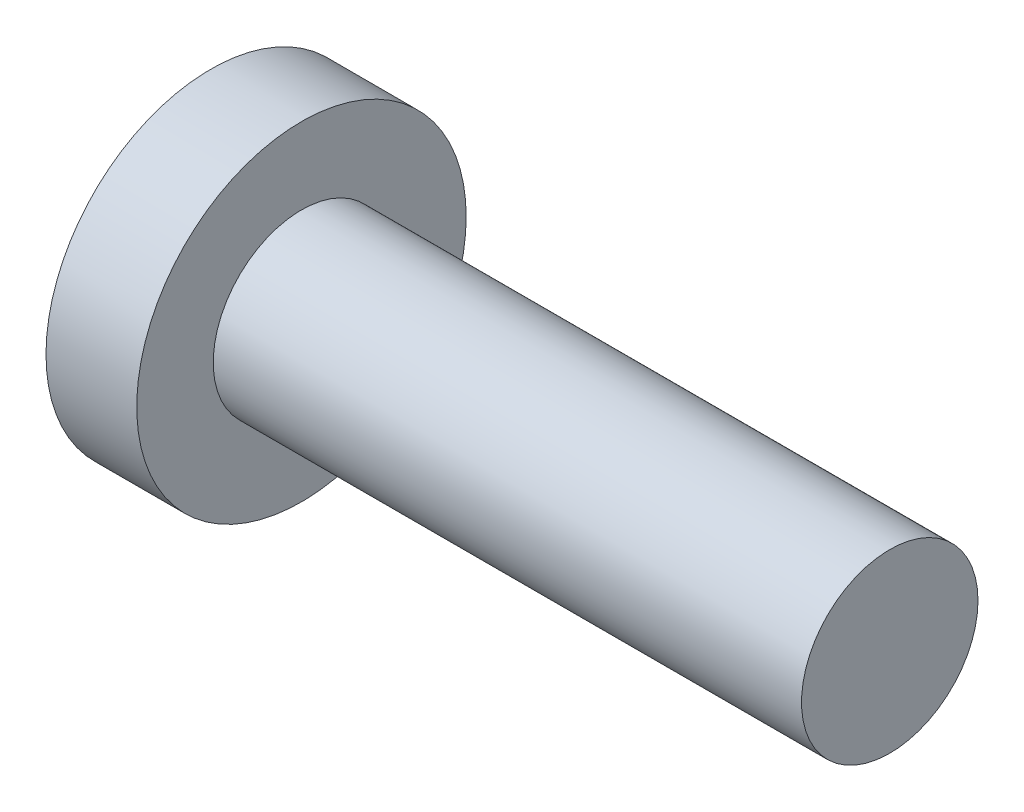
ISO-10303-21;
HEADER;
FILE_DESCRIPTION(('STEP AP214'),'2;1');
FILE_NAME('part.step','',(''),(''),'','','');
FILE_SCHEMA(('AUTOMOTIVE_DESIGN { 1 0 10303 214 1 1 1 1 }'));
ENDSEC;
DATA;
#1=APPLICATION_CONTEXT('core data for automotive mechanical design processes');
#2=APPLICATION_PROTOCOL_DEFINITION('international standard','automotive_design',2000,#1);
#3=PRODUCT_CONTEXT('',#1,'mechanical');
#4=PRODUCT('Part','Part','',(#3));
#5=PRODUCT_RELATED_PRODUCT_CATEGORY('part','',(#4));
#6=PRODUCT_DEFINITION_FORMATION('','',#4);
#7=PRODUCT_DEFINITION_CONTEXT('part definition',#1,'design');
#8=PRODUCT_DEFINITION('design','',#6,#7);
#9=PRODUCT_DEFINITION_SHAPE('','',#8);
#10=(LENGTH_UNIT() NAMED_UNIT(*) SI_UNIT(.MILLI.,.METRE.));
#11=(NAMED_UNIT(*) PLANE_ANGLE_UNIT() SI_UNIT($,.RADIAN.));
#12=(NAMED_UNIT(*) SI_UNIT($,.STERADIAN.) SOLID_ANGLE_UNIT());
#13=UNCERTAINTY_MEASURE_WITH_UNIT(LENGTH_MEASURE(1.E-05),#10,'distance_accuracy_value','');
#14=(GEOMETRIC_REPRESENTATION_CONTEXT(3) GLOBAL_UNCERTAINTY_ASSIGNED_CONTEXT((#13)) GLOBAL_UNIT_ASSIGNED_CONTEXT((#10,
#11,#12)) REPRESENTATION_CONTEXT('',''));
#15=CARTESIAN_POINT('',(0.,0.,0.));
#16=DIRECTION('',(0.,0.,1.));
#17=DIRECTION('',(1.,0.,0.));
#18=AXIS2_PLACEMENT_3D('',#15,#16,#17);
#19=CARTESIAN_POINT('',(5.,0.,0.));
#20=DIRECTION('',(1.,0.,0.));
#21=DIRECTION('',(0.,1.,0.));
#22=AXIS2_PLACEMENT_3D('',#19,#20,#21);
#23=SPHERICAL_SURFACE('',#22,5.);
#24=CARTESIAN_POINT('',(0.857536964558405,0.,0.));
#25=DIRECTION('',(1.,0.,0.));
#26=DIRECTION('',(0.,0.,-1.));
#27=AXIS2_PLACEMENT_3D('',#24,#25,#26);
#28=CIRCLE('',#27,2.8);
#29=CARTESIAN_POINT('',(0.857536964558405,0.,-2.8));
#30=VERTEX_POINT('',#29);
#31=EDGE_CURVE('E229',#30,#30,#28,.T.);
#32=ORIENTED_EDGE('',*,*,#31,.F.);
#33=EDGE_LOOP('',(#32));
#34=FACE_BOUND('',#33,.T.);
#35=CARTESIAN_POINT('',(5.,-0.3,0.));
#36=DIRECTION('',(0.,1.,0.));
#37=DIRECTION('',(0.,0.,1.));
#38=AXIS2_PLACEMENT_3D('',#35,#36,#37);
#39=CIRCLE('',#38,4.99099188538711);
#40=CARTESIAN_POINT('',(0.204192141108151,-0.3,1.3821096123648));
#41=VERTEX_POINT('',#40);
#42=CARTESIAN_POINT('',(0.0452043432650024,-0.3,0.6));
#43=VERTEX_POINT('',#42);
#44=EDGE_CURVE('E163',#41,#43,#39,.F.);
#45=ORIENTED_EDGE('',*,*,#44,.T.);
#46=CARTESIAN_POINT('',(0.0452043432650024,-0.3,0.6));
#47=CARTESIAN_POINT('',(0.0431803765733258,-0.299985307216759,0.583300664423279));
#48=CARTESIAN_POINT('',(0.0413275176268076,-0.301393621844251,0.566581310147069));
#49=CARTESIAN_POINT('',(0.0380100157488106,-0.306971694528783,0.533576799844294));
#50=CARTESIAN_POINT('',(0.0365452230698608,-0.311140385229223,0.517291478520808));
#51=CARTESIAN_POINT('',(0.0340472247062486,-0.322159146630374,0.48560301538607));
#52=CARTESIAN_POINT('',(0.0330143639783939,-0.329011352060551,0.470200587124305));
#53=CARTESIAN_POINT('',(0.0314127307694625,-0.345205676257373,0.440745323067069));
#54=CARTESIAN_POINT('',(0.0308438058607194,-0.354546975884403,0.426692045343612));
#55=CARTESIAN_POINT('',(0.0301895329231602,-0.375375503630217,0.400444519821415));
#56=CARTESIAN_POINT('',(0.0301004392402796,-0.386845384782283,0.38823659768892));
#57=CARTESIAN_POINT('',(0.0303984595749411,-0.411653153039893,0.365897305977699));
#58=CARTESIAN_POINT('',(0.0307856444365276,-0.424991317781719,0.355766245583268));
#59=CARTESIAN_POINT('',(0.0320223810339676,-0.453099677373167,0.337899284835797));
#60=CARTESIAN_POINT('',(0.0328703456862313,-0.467864814543113,0.33015530522925));
#61=CARTESIAN_POINT('',(0.0350026994062989,-0.498444042646254,0.317225069756468));
#62=CARTESIAN_POINT('',(0.0362869304045914,-0.514257751989368,0.312037889168157));
#63=CARTESIAN_POINT('',(0.0388210734003053,-0.541786224745503,0.305467740201195));
#64=CARTESIAN_POINT('',(0.0399723661586705,-0.553355690495333,0.303417160437875));
#65=CARTESIAN_POINT('',(0.0424563450668784,-0.576618891467464,0.300683149774227));
#66=CARTESIAN_POINT('',(0.0437887689490348,-0.588312424882147,0.299997764205198));
#67=CARTESIAN_POINT('',(0.0452043432650014,-0.6,0.299999999999999));
#68=B_SPLINE_CURVE_WITH_KNOTS('',3,(#46,#47,#48,#49,#50,#51,#52,#53,#54,#55,#56,#57,#58,#59,#60,
#61,#62,#63,#64,#65,#66,#67),.UNSPECIFIED.,.F.,.F.,(4,2,2,2,2,2,2,2,2,2,4),(0.,
0.0504040124836523,0.100788546583663,0.151213243139993,0.201621365810884,0.251635416538133,
0.3016569075042,0.351507189411116,0.401339428623963,0.436680545510309,0.471971024931029),.UNSPECIFIED.);
#69=CARTESIAN_POINT('',(0.0452043432650024,-0.6,0.299999999999999));
#70=VERTEX_POINT('',#69);
#71=EDGE_CURVE('E148',#43,#70,#68,.T.);
#72=ORIENTED_EDGE('',*,*,#71,.T.);
#73=CARTESIAN_POINT('',(5.,0.,0.299999999999999));
#74=DIRECTION('',(0.,0.,-1.));
#75=DIRECTION('',(0.,1.,0.));
#76=AXIS2_PLACEMENT_3D('',#73,#74,#75);
#77=CIRCLE('',#76,4.99099188538711);
#78=CARTESIAN_POINT('',(0.204192141108151,-1.3821096123648,0.299999999999999));
#79=VERTEX_POINT('',#78);
#80=EDGE_CURVE('E172',#70,#79,#77,.F.);
#81=ORIENTED_EDGE('',*,*,#80,.T.);
#82=CARTESIAN_POINT('',(4.39951905283833,1.0400635094611,0.));
#83=DIRECTION('',(-0.500000000000001,0.866025403784438,0.));
#84=DIRECTION('',(-0.866025403784438,-0.500000000000001,0.));
#85=AXIS2_PLACEMENT_3D('',#82,#83,#84);
#86=CIRCLE('',#85,4.8536265336739);
#87=CARTESIAN_POINT('',(0.204192141108151,-1.3821096123648,-0.3));
#88=VERTEX_POINT('',#87);
#89=EDGE_CURVE('E175',#79,#88,#86,.F.);
#90=ORIENTED_EDGE('',*,*,#89,.T.);
#91=CARTESIAN_POINT('',(5.,0.,-0.3));
#92=DIRECTION('',(0.,0.,1.));
#93=DIRECTION('',(0.,-1.,0.));
#94=AXIS2_PLACEMENT_3D('',#91,#92,#93);
#95=CIRCLE('',#94,4.99099188538711);
#96=CARTESIAN_POINT('',(0.0452043432650024,-0.6,-0.3));
#97=VERTEX_POINT('',#96);
#98=EDGE_CURVE('E182',#88,#97,#95,.F.);
#99=ORIENTED_EDGE('',*,*,#98,.T.);
#100=CARTESIAN_POINT('',(0.0452043432650024,-0.6,-0.3));
#101=CARTESIAN_POINT('',(0.0431803765733258,-0.58330066442328,-0.299985307216759));
#102=CARTESIAN_POINT('',(0.0413275176268076,-0.56658131014707,-0.30139362184425));
#103=CARTESIAN_POINT('',(0.0380100157488106,-0.533576799844294,-0.306971694528783));
#104=CARTESIAN_POINT('',(0.0365452230698608,-0.517291478520808,-0.311140385229223));
#105=CARTESIAN_POINT('',(0.0340472247062486,-0.485603015386071,-0.322159146630374));
#106=CARTESIAN_POINT('',(0.0330143639783939,-0.470200587124306,-0.329011352060551));
#107=CARTESIAN_POINT('',(0.0314127307694625,-0.44074532306707,-0.345205676257373));
#108=CARTESIAN_POINT('',(0.0308438058607194,-0.426692045343612,-0.354546975884403));
#109=CARTESIAN_POINT('',(0.0301895329231602,-0.400444519821415,-0.375375503630217));
#110=CARTESIAN_POINT('',(0.0301004392402796,-0.38823659768892,-0.386845384782283));
#111=CARTESIAN_POINT('',(0.0303984595749411,-0.365897305977699,-0.411653153039893));
#112=CARTESIAN_POINT('',(0.0307856444365276,-0.355766245583269,-0.424991317781719));
#113=CARTESIAN_POINT('',(0.0320223810339676,-0.337899284835798,-0.453099677373167));
#114=CARTESIAN_POINT('',(0.0328703456862313,-0.33015530522925,-0.467864814543113));
#115=CARTESIAN_POINT('',(0.0350026994062989,-0.317225069756469,-0.498444042646254));
#116=CARTESIAN_POINT('',(0.0362869304045914,-0.312037889168157,-0.514257751989369));
#117=CARTESIAN_POINT('',(0.0388210734003053,-0.305467740201196,-0.541786224745503));
#118=CARTESIAN_POINT('',(0.0399723661586705,-0.303417160437875,-0.553355690495333));
#119=CARTESIAN_POINT('',(0.0424563450668784,-0.300683149774227,-0.576618891467463));
#120=CARTESIAN_POINT('',(0.0437887689490348,-0.299997764205199,-0.588312424882147));
#121=CARTESIAN_POINT('',(0.0452043432650014,-0.3,-0.6));
#122=B_SPLINE_CURVE_WITH_KNOTS('',3,(#100,#101,#102,#103,#104,#105,#106,#107,#108,#109,#110,
#111,#112,#113,#114,#115,#116,#117,#118,#119,#120,#121),.UNSPECIFIED.,.F.,.F.,(4,2,2,2,2,2,2,2,
2,2,4),(0.,0.0504040124836524,0.100788546583663,0.151213243139993,0.201621365810884,
0.251635416538133,0.3016569075042,0.351507189411116,0.401339428623963,0.436680545510309,
0.471971024931029),.UNSPECIFIED.);
#123=CARTESIAN_POINT('',(0.0452043432650024,-0.3,-0.6));
#124=VERTEX_POINT('',#123);
#125=EDGE_CURVE('E159',#97,#124,#122,.T.);
#126=ORIENTED_EDGE('',*,*,#125,.T.);
#127=CARTESIAN_POINT('',(5.,-0.3,0.));
#128=DIRECTION('',(0.,1.,0.));
#129=DIRECTION('',(0.,0.,1.));
#130=AXIS2_PLACEMENT_3D('',#127,#128,#129);
#131=CIRCLE('',#130,4.99099188538711);
#132=CARTESIAN_POINT('',(0.204192141108152,-0.3,-1.3821096123648));
#133=VERTEX_POINT('',#132);
#134=EDGE_CURVE('E180',#124,#133,#131,.F.);
#135=ORIENTED_EDGE('',*,*,#134,.T.);
#136=CARTESIAN_POINT('',(4.39951905283833,0.,1.0400635094611));
#137=DIRECTION('',(-0.500000000000001,0.,0.866025403784438));
#138=DIRECTION('',(0.866025403784438,0.,0.500000000000001));
#139=AXIS2_PLACEMENT_3D('',#136,#137,#138);
#140=CIRCLE('',#139,4.8536265336739);
#141=CARTESIAN_POINT('',(0.204192141108152,0.3,-1.3821096123648));
#142=VERTEX_POINT('',#141);
#143=EDGE_CURVE('E183',#133,#142,#140,.F.);
#144=ORIENTED_EDGE('',*,*,#143,.T.);
#145=CARTESIAN_POINT('',(5.,0.3,0.));
#146=DIRECTION('',(0.,-1.,0.));
#147=DIRECTION('',(0.,0.,-1.));
#148=AXIS2_PLACEMENT_3D('',#145,#146,#147);
#149=CIRCLE('',#148,4.99099188538711);
#150=CARTESIAN_POINT('',(0.0452043432650024,0.3,-0.6));
#151=VERTEX_POINT('',#150);
#152=EDGE_CURVE('E184',#142,#151,#149,.F.);
#153=ORIENTED_EDGE('',*,*,#152,.T.);
#154=CARTESIAN_POINT('',(0.0452043432650024,0.3,-0.6));
#155=CARTESIAN_POINT('',(0.0431803765733258,0.299985307216759,-0.58330066442328));
#156=CARTESIAN_POINT('',(0.0413275176268076,0.30139362184425,-0.56658131014707));
#157=CARTESIAN_POINT('',(0.0380100157488106,0.306971694528783,-0.533576799844294));
#158=CARTESIAN_POINT('',(0.0365452230698608,0.311140385229223,-0.517291478520808));
#159=CARTESIAN_POINT('',(0.0340472247062486,0.322159146630374,-0.485603015386071));
#160=CARTESIAN_POINT('',(0.0330143639783939,0.329011352060551,-0.470200587124306));
#161=CARTESIAN_POINT('',(0.0314127307694625,0.345205676257373,-0.44074532306707));
#162=CARTESIAN_POINT('',(0.0308438058607194,0.354546975884403,-0.426692045343612));
#163=CARTESIAN_POINT('',(0.0301895329231602,0.375375503630217,-0.400444519821415));
#164=CARTESIAN_POINT('',(0.0301004392402796,0.386845384782283,-0.38823659768892));
#165=CARTESIAN_POINT('',(0.0303984595749411,0.411653153039893,-0.365897305977699));
#166=CARTESIAN_POINT('',(0.0307856444365276,0.424991317781719,-0.355766245583269));
#167=CARTESIAN_POINT('',(0.0320223810339676,0.453099677373167,-0.337899284835798));
#168=CARTESIAN_POINT('',(0.0328703456862313,0.467864814543113,-0.33015530522925));
#169=CARTESIAN_POINT('',(0.0350026994062989,0.498444042646254,-0.317225069756469));
#170=CARTESIAN_POINT('',(0.0362869304045914,0.514257751989369,-0.312037889168157));
#171=CARTESIAN_POINT('',(0.0388210734003053,0.541786224745503,-0.305467740201196));
#172=CARTESIAN_POINT('',(0.0399723661586705,0.553355690495333,-0.303417160437875));
#173=CARTESIAN_POINT('',(0.0424563450668784,0.576618891467463,-0.300683149774227));
#174=CARTESIAN_POINT('',(0.0437887689490348,0.588312424882147,-0.299997764205199));
#175=CARTESIAN_POINT('',(0.0452043432650014,0.6,-0.3));
#176=B_SPLINE_CURVE_WITH_KNOTS('',3,(#154,#155,#156,#157,#158,#159,#160,#161,#162,#163,#164,
#165,#166,#167,#168,#169,#170,#171,#172,#173,#174,#175),.UNSPECIFIED.,.F.,.F.,(4,2,2,2,2,2,2,2,
2,2,4),(0.,0.0504040124836524,0.100788546583663,0.151213243139993,0.201621365810884,
0.251635416538133,0.3016569075042,0.351507189411116,0.401339428623963,0.436680545510309,
0.471971024931029),.UNSPECIFIED.);
#177=CARTESIAN_POINT('',(0.0452043432650024,0.6,-0.3));
#178=VERTEX_POINT('',#177);
#179=EDGE_CURVE('E166',#151,#178,#176,.T.);
#180=ORIENTED_EDGE('',*,*,#179,.T.);
#181=CARTESIAN_POINT('',(5.,0.,-0.3));
#182=DIRECTION('',(0.,0.,1.));
#183=DIRECTION('',(0.,-1.,0.));
#184=AXIS2_PLACEMENT_3D('',#181,#182,#183);
#185=CIRCLE('',#184,4.99099188538711);
#186=CARTESIAN_POINT('',(0.204192141108151,1.3821096123648,-0.3));
#187=VERTEX_POINT('',#186);
#188=EDGE_CURVE('E187',#178,#187,#185,.F.);
#189=ORIENTED_EDGE('',*,*,#188,.T.);
#190=CARTESIAN_POINT('',(4.39951905283833,-1.0400635094611,0.));
#191=DIRECTION('',(-0.500000000000001,-0.866025403784438,0.));
#192=DIRECTION('',(0.866025403784438,-0.500000000000001,0.));
#193=AXIS2_PLACEMENT_3D('',#190,#191,#192);
#194=CIRCLE('',#193,4.8536265336739);
#195=CARTESIAN_POINT('',(0.204192141108151,1.3821096123648,0.3));
#196=VERTEX_POINT('',#195);
#197=EDGE_CURVE('E213',#187,#196,#194,.F.);
#198=ORIENTED_EDGE('',*,*,#197,.T.);
#199=CARTESIAN_POINT('',(5.,0.,0.299999999999999));
#200=DIRECTION('',(0.,0.,-1.));
#201=DIRECTION('',(0.,1.,0.));
#202=AXIS2_PLACEMENT_3D('',#199,#200,#201);
#203=CIRCLE('',#202,4.99099188538711);
#204=CARTESIAN_POINT('',(0.0452043432650024,0.6,0.3));
#205=VERTEX_POINT('',#204);
#206=EDGE_CURVE('E216',#196,#205,#203,.F.);
#207=ORIENTED_EDGE('',*,*,#206,.T.);
#208=CARTESIAN_POINT('',(0.0452043432650024,0.6,0.3));
#209=CARTESIAN_POINT('',(0.0431803765733258,0.58330066442328,0.299985307216758));
#210=CARTESIAN_POINT('',(0.0413275176268076,0.56658131014707,0.30139362184425));
#211=CARTESIAN_POINT('',(0.0380100157488106,0.533576799844294,0.306971694528782));
#212=CARTESIAN_POINT('',(0.0365452230698608,0.517291478520808,0.311140385229223));
#213=CARTESIAN_POINT('',(0.0340472247062486,0.485603015386071,0.322159146630374));
#214=CARTESIAN_POINT('',(0.0330143639783939,0.470200587124306,0.329011352060551));
#215=CARTESIAN_POINT('',(0.0314127307694625,0.44074532306707,0.345205676257372));
#216=CARTESIAN_POINT('',(0.0308438058607194,0.426692045343612,0.354546975884402));
#217=CARTESIAN_POINT('',(0.0301895329231602,0.400444519821415,0.375375503630217));
#218=CARTESIAN_POINT('',(0.0301004392402796,0.38823659768892,0.386845384782283));
#219=CARTESIAN_POINT('',(0.0303984595749411,0.365897305977699,0.411653153039892));
#220=CARTESIAN_POINT('',(0.0307856444365276,0.355766245583269,0.424991317781719));
#221=CARTESIAN_POINT('',(0.0320223810339676,0.337899284835798,0.453099677373166));
#222=CARTESIAN_POINT('',(0.0328703456862313,0.33015530522925,0.467864814543113));
#223=CARTESIAN_POINT('',(0.0350026994062988,0.317225069756469,0.498444042646254));
#224=CARTESIAN_POINT('',(0.0362869304045914,0.312037889168157,0.514257751989368));
#225=CARTESIAN_POINT('',(0.0388210734003053,0.305467740201196,0.541786224745503));
#226=CARTESIAN_POINT('',(0.0399723661586704,0.303417160437875,0.553355690495333));
#227=CARTESIAN_POINT('',(0.0424563450668784,0.300683149774227,0.576618891467463));
#228=CARTESIAN_POINT('',(0.0437887689490348,0.299997764205199,0.588312424882147));
#229=CARTESIAN_POINT('',(0.0452043432650014,0.3,0.599999999999999));
#230=B_SPLINE_CURVE_WITH_KNOTS('',3,(#208,#209,#210,#211,#212,#213,#214,#215,#216,#217,#218,
#219,#220,#221,#222,#223,#224,#225,#226,#227,#228,#229),.UNSPECIFIED.,.F.,.F.,(4,2,2,2,2,2,2,2,
2,2,4),(0.,0.0504040124836524,0.100788546583663,0.151213243139993,0.201621365810884,
0.251635416538133,0.3016569075042,0.351507189411116,0.401339428623963,0.436680545510309,
0.471971024931029),.UNSPECIFIED.);
#231=CARTESIAN_POINT('',(0.0452043432650024,0.3,0.599999999999999));
#232=VERTEX_POINT('',#231);
#233=EDGE_CURVE('E286',#205,#232,#230,.T.);
#234=ORIENTED_EDGE('',*,*,#233,.T.);
#235=CARTESIAN_POINT('',(5.,0.3,0.));
#236=DIRECTION('',(0.,-1.,0.));
#237=DIRECTION('',(0.,0.,-1.));
#238=AXIS2_PLACEMENT_3D('',#235,#236,#237);
#239=CIRCLE('',#238,4.99099188538711);
#240=CARTESIAN_POINT('',(0.204192141108151,0.3,1.3821096123648));
#241=VERTEX_POINT('',#240);
#242=EDGE_CURVE('E167',#232,#241,#239,.F.);
#243=ORIENTED_EDGE('',*,*,#242,.T.);
#244=CARTESIAN_POINT('',(4.39951905283833,0.,-1.0400635094611));
#245=DIRECTION('',(-0.500000000000001,0.,-0.866025403784438));
#246=DIRECTION('',(-0.866025403784438,0.,0.500000000000001));
#247=AXIS2_PLACEMENT_3D('',#244,#245,#246);
#248=CIRCLE('',#247,4.8536265336739);
#249=EDGE_CURVE('E171',#241,#41,#248,.F.);
#250=ORIENTED_EDGE('',*,*,#249,.T.);
#251=EDGE_LOOP('',(#45,#72,#81,#90,#99,#126,#135,#144,#153,#180,#189,#198,#207,#234,#243,#250));
#252=FACE_BOUND('',#251,.T.);
#253=ADVANCED_FACE('F38',(#34,#252),#23,.T.);
#254=CARTESIAN_POINT('',(12.4,1.5,0.));
#255=DIRECTION('',(1.,0.,0.));
#256=DIRECTION('',(0.,0.,-1.));
#257=AXIS2_PLACEMENT_3D('',#254,#255,#256);
#258=PLANE('',#257);
#259=CARTESIAN_POINT('',(12.4,0.,0.));
#260=DIRECTION('',(1.,0.,0.));
#261=DIRECTION('',(0.,0.,-1.));
#262=AXIS2_PLACEMENT_3D('',#259,#260,#261);
#263=CIRCLE('',#262,1.5);
#264=CARTESIAN_POINT('',(12.4,0.,-1.5));
#265=VERTEX_POINT('',#264);
#266=EDGE_CURVE('E268',#265,#265,#263,.T.);
#267=ORIENTED_EDGE('',*,*,#266,.T.);
#268=EDGE_LOOP('',(#267));
#269=FACE_BOUND('',#268,.T.);
#270=ADVANCED_FACE('F324',(#269),#258,.T.);
#271=CARTESIAN_POINT('',(4.51581291088132,0.,0.));
#272=DIRECTION('',(1.,0.,0.));
#273=DIRECTION('',(0.,0.,-1.));
#274=AXIS2_PLACEMENT_3D('',#271,#272,#273);
#275=CYLINDRICAL_SURFACE('',#274,1.5);
#276=CARTESIAN_POINT('',(2.4,0.,0.));
#277=DIRECTION('',(1.,0.,0.));
#278=DIRECTION('',(0.,0.,-1.));
#279=AXIS2_PLACEMENT_3D('',#276,#277,#278);
#280=CIRCLE('',#279,1.5);
#281=CARTESIAN_POINT('',(2.4,0.,-1.5));
#282=VERTEX_POINT('',#281);
#283=EDGE_CURVE('E270',#282,#282,#280,.T.);
#284=ORIENTED_EDGE('',*,*,#283,.T.);
#285=EDGE_LOOP('',(#284));
#286=FACE_BOUND('',#285,.T.);
#287=ORIENTED_EDGE('',*,*,#266,.F.);
#288=EDGE_LOOP('',(#287));
#289=FACE_BOUND('',#288,.T.);
#290=ADVANCED_FACE('F329',(#286,#289),#275,.T.);
#291=CARTESIAN_POINT('',(2.4,1.8,0.));
#292=DIRECTION('',(1.,0.,0.));
#293=DIRECTION('',(0.,0.,-1.));
#294=AXIS2_PLACEMENT_3D('',#291,#292,#293);
#295=PLANE('',#294);
#296=CARTESIAN_POINT('',(2.4,0.,0.));
#297=DIRECTION('',(1.,0.,0.));
#298=DIRECTION('',(0.,0.,-1.));
#299=AXIS2_PLACEMENT_3D('',#296,#297,#298);
#300=CIRCLE('',#299,2.8);
#301=CARTESIAN_POINT('',(2.4,0.,-2.8));
#302=VERTEX_POINT('',#301);
#303=EDGE_CURVE('E275',#302,#302,#300,.T.);
#304=ORIENTED_EDGE('',*,*,#303,.T.);
#305=EDGE_LOOP('',(#304));
#306=FACE_BOUND('',#305,.T.);
#307=ORIENTED_EDGE('',*,*,#283,.F.);
#308=EDGE_LOOP('',(#307));
#309=FACE_BOUND('',#308,.T.);
#310=ADVANCED_FACE('F340',(#306,#309),#295,.T.);
#311=CARTESIAN_POINT('',(4.51581291088132,0.,0.));
#312=DIRECTION('',(1.,0.,0.));
#313=DIRECTION('',(0.,0.,-1.));
#314=AXIS2_PLACEMENT_3D('',#311,#312,#313);
#315=CYLINDRICAL_SURFACE('',#314,2.8);
#316=ORIENTED_EDGE('',*,*,#31,.T.);
#317=EDGE_LOOP('',(#316));
#318=FACE_BOUND('',#317,.T.);
#319=ORIENTED_EDGE('',*,*,#303,.F.);
#320=EDGE_LOOP('',(#319));
#321=FACE_BOUND('',#320,.T.);
#322=ADVANCED_FACE('F320',(#318,#321),#315,.T.);
#323=CARTESIAN_POINT('',(1.68,0.3,0.299999999999999));
#324=DIRECTION('',(0.,-1.,0.));
#325=DIRECTION('',(0.,0.,-1.));
#326=AXIS2_PLACEMENT_3D('',#323,#324,#325);
#327=PLANE('',#326);
#328=ORIENTED_EDGE('',*,*,#242,.F.);
#329=DIRECTION('',(-1.,0.,0.));
#330=VECTOR('',#329,1.);
#331=CARTESIAN_POINT('',(1.68,0.3,0.599999999999999));
#332=LINE('',#331,#330);
#333=CARTESIAN_POINT('',(1.55884572681199,0.3,0.599999999999999));
#334=VERTEX_POINT('',#333);
#335=EDGE_CURVE('E375',#232,#334,#332,.F.);
#336=ORIENTED_EDGE('',*,*,#335,.T.);
#337=DIRECTION('',(-0.866025403784438,0.,0.500000000000001));
#338=VECTOR('',#337,1.);
#339=CARTESIAN_POINT('',(0.,0.299999999999999,1.5));
#340=LINE('',#339,#338);
#341=EDGE_CURVE('E227',#334,#241,#340,.T.);
#342=ORIENTED_EDGE('',*,*,#341,.T.);
#343=EDGE_LOOP('',(#328,#336,#342));
#344=FACE_BOUND('',#343,.T.);
#345=ADVANCED_FACE('F313',(#344),#327,.T.);
#346=CARTESIAN_POINT('',(0.,0.,1.5));
#347=DIRECTION('',(-0.500000000000001,0.,-0.866025403784438));
#348=DIRECTION('',(-0.866025403784438,0.,0.500000000000001));
#349=AXIS2_PLACEMENT_3D('',#346,#347,#348);
#350=PLANE('',#349);
#351=ORIENTED_EDGE('',*,*,#341,.F.);
#352=CARTESIAN_POINT('',(1.55884572681199,0.6,0.6));
#353=DIRECTION('',(-0.500000000000001,0.,-0.866025403784438));
#354=DIRECTION('',(-0.866025403784438,0.,0.500000000000001));
#355=AXIS2_PLACEMENT_3D('',#352,#353,#354);
#356=ELLIPSE('',#355,0.599999999999999,0.3);
#357=CARTESIAN_POINT('',(1.68,0.308268592658541,0.530051547761426));
#358=VERTEX_POINT('',#357);
#359=EDGE_CURVE('E234',#334,#358,#356,.F.);
#360=ORIENTED_EDGE('',*,*,#359,.T.);
#361=DIRECTION('',(0.,-1.,0.));
#362=VECTOR('',#361,1.);
#363=CARTESIAN_POINT('',(1.68,0.,0.530051547761426));
#364=LINE('',#363,#362);
#365=CARTESIAN_POINT('',(1.68,-0.308268592658541,0.530051547761426));
#366=VERTEX_POINT('',#365);
#367=EDGE_CURVE('E200',#358,#366,#364,.T.);
#368=ORIENTED_EDGE('',*,*,#367,.T.);
#369=CARTESIAN_POINT('',(1.55884572681199,-0.6,0.599999999999999));
#370=DIRECTION('',(-0.500000000000001,0.,-0.866025403784438));
#371=DIRECTION('',(-0.866025403784438,0.,0.500000000000001));
#372=AXIS2_PLACEMENT_3D('',#369,#370,#371);
#373=ELLIPSE('',#372,0.599999999999999,0.3);
#374=CARTESIAN_POINT('',(1.55884572681199,-0.3,0.6));
#375=VERTEX_POINT('',#374);
#376=EDGE_CURVE('E226',#375,#366,#373,.T.);
#377=ORIENTED_EDGE('',*,*,#376,.F.);
#378=DIRECTION('',(-0.866025403784438,0.,0.500000000000001));
#379=VECTOR('',#378,1.);
#380=CARTESIAN_POINT('',(1.77961524227066,-0.3,0.472538660821069));
#381=LINE('',#380,#379);
#382=EDGE_CURVE('E165',#375,#41,#381,.T.);
#383=ORIENTED_EDGE('',*,*,#382,.T.);
#384=ORIENTED_EDGE('',*,*,#249,.F.);
#385=EDGE_LOOP('',(#351,#360,#368,#377,#383,#384));
#386=FACE_BOUND('',#385,.T.);
#387=ADVANCED_FACE('F311',(#386),#350,.T.);
#388=CARTESIAN_POINT('',(1.68,-0.3,0.299999999999999));
#389=DIRECTION('',(0.,1.,0.));
#390=DIRECTION('',(0.,0.,1.));
#391=AXIS2_PLACEMENT_3D('',#388,#389,#390);
#392=PLANE('',#391);
#393=ORIENTED_EDGE('',*,*,#382,.F.);
#394=DIRECTION('',(-1.,0.,0.));
#395=VECTOR('',#394,1.);
#396=CARTESIAN_POINT('',(1.68,-0.3,0.6));
#397=LINE('',#396,#395);
#398=EDGE_CURVE('E152',#375,#43,#397,.T.);
#399=ORIENTED_EDGE('',*,*,#398,.T.);
#400=ORIENTED_EDGE('',*,*,#44,.F.);
#401=EDGE_LOOP('',(#393,#399,#400));
#402=FACE_BOUND('',#401,.T.);
#403=ADVANCED_FACE('F162',(#402),#392,.T.);
#404=CARTESIAN_POINT('',(1.68,-0.3,0.299999999999999));
#405=DIRECTION('',(0.,0.,-1.));
#406=DIRECTION('',(0.,1.,0.));
#407=AXIS2_PLACEMENT_3D('',#404,#405,#406);
#408=PLANE('',#407);
#409=ORIENTED_EDGE('',*,*,#80,.F.);
#410=DIRECTION('',(-1.,0.,0.));
#411=VECTOR('',#410,1.);
#412=CARTESIAN_POINT('',(1.68,-0.6,0.299999999999999));
#413=LINE('',#412,#411);
#414=CARTESIAN_POINT('',(1.55884572681198,-0.6,0.299999999999999));
#415=VERTEX_POINT('',#414);
#416=EDGE_CURVE('E155',#70,#415,#413,.F.);
#417=ORIENTED_EDGE('',*,*,#416,.T.);
#418=DIRECTION('',(-0.866025403784438,-0.500000000000001,0.));
#419=VECTOR('',#418,1.);
#420=CARTESIAN_POINT('',(0.,-1.5,0.299999999999999));
#421=LINE('',#420,#419);
#422=EDGE_CURVE('E188',#415,#79,#421,.T.);
#423=ORIENTED_EDGE('',*,*,#422,.T.);
#424=EDGE_LOOP('',(#409,#417,#423));
#425=FACE_BOUND('',#424,.T.);
#426=ADVANCED_FACE('F306',(#425),#408,.T.);
#427=CARTESIAN_POINT('',(0.,-1.5,0.));
#428=DIRECTION('',(-0.500000000000001,0.866025403784438,0.));
#429=DIRECTION('',(-0.866025403784438,-0.500000000000001,0.));
#430=AXIS2_PLACEMENT_3D('',#427,#428,#429);
#431=PLANE('',#430);
#432=ORIENTED_EDGE('',*,*,#422,.F.);
#433=CARTESIAN_POINT('',(1.55884572681198,-0.6,0.599999999999999));
#434=DIRECTION('',(-0.500000000000001,0.866025403784438,0.));
#435=DIRECTION('',(-0.866025403784438,-0.500000000000001,0.));
#436=AXIS2_PLACEMENT_3D('',#433,#434,#435);
#437=ELLIPSE('',#436,0.599999999999999,0.3);
#438=CARTESIAN_POINT('',(1.68,-0.530051547761426,0.308268592658541));
#439=VERTEX_POINT('',#438);
#440=EDGE_CURVE('E203',#415,#439,#437,.F.);
#441=ORIENTED_EDGE('',*,*,#440,.T.);
#442=DIRECTION('',(0.,0.,-1.));
#443=VECTOR('',#442,1.);
#444=CARTESIAN_POINT('',(1.68,-0.530051547761426,0.));
#445=LINE('',#444,#443);
#446=CARTESIAN_POINT('',(1.68,-0.530051547761426,-0.308268592658542));
#447=VERTEX_POINT('',#446);
#448=EDGE_CURVE('E197',#439,#447,#445,.T.);
#449=ORIENTED_EDGE('',*,*,#448,.T.);
#450=CARTESIAN_POINT('',(1.55884572681199,-0.6,-0.6));
#451=DIRECTION('',(-0.500000000000001,0.866025403784438,0.));
#452=DIRECTION('',(-0.866025403784438,-0.500000000000001,0.));
#453=AXIS2_PLACEMENT_3D('',#450,#451,#452);
#454=ELLIPSE('',#453,0.599999999999999,0.3);
#455=CARTESIAN_POINT('',(1.55884572681199,-0.6,-0.3));
#456=VERTEX_POINT('',#455);
#457=EDGE_CURVE('E201',#456,#447,#454,.T.);
#458=ORIENTED_EDGE('',*,*,#457,.F.);
#459=DIRECTION('',(-0.866025403784438,-0.500000000000001,0.));
#460=VECTOR('',#459,1.);
#461=CARTESIAN_POINT('',(1.77961524227066,-0.472538660821069,-0.3));
#462=LINE('',#461,#460);
#463=EDGE_CURVE('E191',#456,#88,#462,.T.);
#464=ORIENTED_EDGE('',*,*,#463,.T.);
#465=ORIENTED_EDGE('',*,*,#89,.F.);
#466=EDGE_LOOP('',(#432,#441,#449,#458,#464,#465));
#467=FACE_BOUND('',#466,.T.);
#468=ADVANCED_FACE('F302',(#467),#431,.T.);
#469=CARTESIAN_POINT('',(1.68,-0.3,-0.3));
#470=DIRECTION('',(0.,0.,1.));
#471=DIRECTION('',(0.,-1.,0.));
#472=AXIS2_PLACEMENT_3D('',#469,#470,#471);
#473=PLANE('',#472);
#474=ORIENTED_EDGE('',*,*,#463,.F.);
#475=DIRECTION('',(-1.,0.,0.));
#476=VECTOR('',#475,1.);
#477=CARTESIAN_POINT('',(1.68,-0.6,-0.3));
#478=LINE('',#477,#476);
#479=EDGE_CURVE('E366',#456,#97,#478,.T.);
#480=ORIENTED_EDGE('',*,*,#479,.T.);
#481=ORIENTED_EDGE('',*,*,#98,.F.);
#482=EDGE_LOOP('',(#474,#480,#481));
#483=FACE_BOUND('',#482,.T.);
#484=ADVANCED_FACE('F305',(#483),#473,.T.);
#485=CARTESIAN_POINT('',(1.68,-0.3,-0.3));
#486=DIRECTION('',(0.,1.,0.));
#487=DIRECTION('',(0.,0.,1.));
#488=AXIS2_PLACEMENT_3D('',#485,#486,#487);
#489=PLANE('',#488);
#490=ORIENTED_EDGE('',*,*,#134,.F.);
#491=DIRECTION('',(-1.,0.,0.));
#492=VECTOR('',#491,1.);
#493=CARTESIAN_POINT('',(1.68,-0.3,-0.6));
#494=LINE('',#493,#492);
#495=CARTESIAN_POINT('',(1.55884572681199,-0.3,-0.6));
#496=VERTEX_POINT('',#495);
#497=EDGE_CURVE('E369',#124,#496,#494,.F.);
#498=ORIENTED_EDGE('',*,*,#497,.T.);
#499=DIRECTION('',(-0.866025403784438,0.,-0.500000000000001));
#500=VECTOR('',#499,1.);
#501=CARTESIAN_POINT('',(0.,-0.3,-1.5));
#502=LINE('',#501,#500);
#503=EDGE_CURVE('E196',#496,#133,#502,.T.);
#504=ORIENTED_EDGE('',*,*,#503,.T.);
#505=EDGE_LOOP('',(#490,#498,#504));
#506=FACE_BOUND('',#505,.T.);
#507=ADVANCED_FACE('F310',(#506),#489,.T.);
#508=CARTESIAN_POINT('',(0.,0.,-1.5));
#509=DIRECTION('',(-0.500000000000001,0.,0.866025403784438));
#510=DIRECTION('',(0.866025403784438,0.,0.500000000000001));
#511=AXIS2_PLACEMENT_3D('',#508,#509,#510);
#512=PLANE('',#511);
#513=ORIENTED_EDGE('',*,*,#503,.F.);
#514=CARTESIAN_POINT('',(1.55884572681199,-0.6,-0.6));
#515=DIRECTION('',(-0.500000000000001,0.,0.866025403784438));
#516=DIRECTION('',(-0.866025403784438,0.,-0.500000000000001));
#517=AXIS2_PLACEMENT_3D('',#514,#515,#516);
#518=ELLIPSE('',#517,0.599999999999999,0.3);
#519=CARTESIAN_POINT('',(1.68,-0.308268592658541,-0.530051547761427));
#520=VERTEX_POINT('',#519);
#521=EDGE_CURVE('E11',#496,#520,#518,.F.);
#522=ORIENTED_EDGE('',*,*,#521,.T.);
#523=DIRECTION('',(0.,1.,0.));
#524=VECTOR('',#523,1.);
#525=CARTESIAN_POINT('',(1.68,0.,-0.530051547761427));
#526=LINE('',#525,#524);
#527=CARTESIAN_POINT('',(1.68,0.308268592658541,-0.530051547761427));
#528=VERTEX_POINT('',#527);
#529=EDGE_CURVE('E199',#520,#528,#526,.T.);
#530=ORIENTED_EDGE('',*,*,#529,.T.);
#531=CARTESIAN_POINT('',(1.55884572681199,0.6,-0.6));
#532=DIRECTION('',(-0.500000000000001,0.,0.866025403784438));
#533=DIRECTION('',(-0.866025403784438,0.,-0.500000000000001));
#534=AXIS2_PLACEMENT_3D('',#531,#532,#533);
#535=ELLIPSE('',#534,0.599999999999999,0.3);
#536=CARTESIAN_POINT('',(1.55884572681199,0.3,-0.6));
#537=VERTEX_POINT('',#536);
#538=EDGE_CURVE('E47',#537,#528,#535,.T.);
#539=ORIENTED_EDGE('',*,*,#538,.F.);
#540=DIRECTION('',(-0.866025403784438,0.,-0.500000000000001));
#541=VECTOR('',#540,1.);
#542=CARTESIAN_POINT('',(1.77961524227066,0.3,-0.47253866082107));
#543=LINE('',#542,#541);
#544=EDGE_CURVE('E211',#537,#142,#543,.T.);
#545=ORIENTED_EDGE('',*,*,#544,.T.);
#546=ORIENTED_EDGE('',*,*,#143,.F.);
#547=EDGE_LOOP('',(#513,#522,#530,#539,#545,#546));
#548=FACE_BOUND('',#547,.T.);
#549=ADVANCED_FACE('F254',(#548),#512,.T.);
#550=CARTESIAN_POINT('',(1.68,0.3,-0.3));
#551=DIRECTION('',(0.,-1.,0.));
#552=DIRECTION('',(0.,0.,-1.));
#553=AXIS2_PLACEMENT_3D('',#550,#551,#552);
#554=PLANE('',#553);
#555=ORIENTED_EDGE('',*,*,#544,.F.);
#556=DIRECTION('',(-1.,0.,0.));
#557=VECTOR('',#556,1.);
#558=CARTESIAN_POINT('',(1.68,0.3,-0.6));
#559=LINE('',#558,#557);
#560=EDGE_CURVE('E250',#537,#151,#559,.T.);
#561=ORIENTED_EDGE('',*,*,#560,.T.);
#562=ORIENTED_EDGE('',*,*,#152,.F.);
#563=EDGE_LOOP('',(#555,#561,#562));
#564=FACE_BOUND('',#563,.T.);
#565=ADVANCED_FACE('F309',(#564),#554,.T.);
#566=CARTESIAN_POINT('',(1.68,0.3,-0.3));
#567=DIRECTION('',(0.,0.,1.));
#568=DIRECTION('',(0.,-1.,0.));
#569=AXIS2_PLACEMENT_3D('',#566,#567,#568);
#570=PLANE('',#569);
#571=ORIENTED_EDGE('',*,*,#188,.F.);
#572=DIRECTION('',(-1.,0.,0.));
#573=VECTOR('',#572,1.);
#574=CARTESIAN_POINT('',(1.68,0.6,-0.3));
#575=LINE('',#574,#573);
#576=CARTESIAN_POINT('',(1.55884572681198,0.6,-0.3));
#577=VERTEX_POINT('',#576);
#578=EDGE_CURVE('E379',#178,#577,#575,.F.);
#579=ORIENTED_EDGE('',*,*,#578,.T.);
#580=DIRECTION('',(-0.866025403784438,0.500000000000001,0.));
#581=VECTOR('',#580,1.);
#582=CARTESIAN_POINT('',(0.,1.5,-0.3));
#583=LINE('',#582,#581);
#584=EDGE_CURVE('E208',#577,#187,#583,.T.);
#585=ORIENTED_EDGE('',*,*,#584,.T.);
#586=EDGE_LOOP('',(#571,#579,#585));
#587=FACE_BOUND('',#586,.T.);
#588=ADVANCED_FACE('F399',(#587),#570,.T.);
#589=CARTESIAN_POINT('',(0.,1.5,0.));
#590=DIRECTION('',(-0.500000000000001,-0.866025403784438,0.));
#591=DIRECTION('',(0.866025403784438,-0.500000000000001,0.));
#592=AXIS2_PLACEMENT_3D('',#589,#590,#591);
#593=PLANE('',#592);
#594=ORIENTED_EDGE('',*,*,#584,.F.);
#595=CARTESIAN_POINT('',(1.55884572681199,0.6,-0.6));
#596=DIRECTION('',(-0.500000000000001,-0.866025403784438,0.));
#597=DIRECTION('',(-0.866025403784438,0.500000000000001,0.));
#598=AXIS2_PLACEMENT_3D('',#595,#596,#597);
#599=ELLIPSE('',#598,0.599999999999999,0.3);
#600=CARTESIAN_POINT('',(1.68,0.530051547761426,-0.308268592658542));
#601=VERTEX_POINT('',#600);
#602=EDGE_CURVE('E223',#577,#601,#599,.F.);
#603=ORIENTED_EDGE('',*,*,#602,.T.);
#604=DIRECTION('',(0.,0.,1.));
#605=VECTOR('',#604,1.);
#606=CARTESIAN_POINT('',(1.68,0.530051547761426,0.));
#607=LINE('',#606,#605);
#608=CARTESIAN_POINT('',(1.68,0.530051547761426,0.308268592658541));
#609=VERTEX_POINT('',#608);
#610=EDGE_CURVE('E219',#601,#609,#607,.T.);
#611=ORIENTED_EDGE('',*,*,#610,.T.);
#612=CARTESIAN_POINT('',(1.55884572681199,0.6,0.6));
#613=DIRECTION('',(-0.500000000000001,-0.866025403784438,0.));
#614=DIRECTION('',(-0.866025403784438,0.500000000000001,0.));
#615=AXIS2_PLACEMENT_3D('',#612,#613,#614);
#616=ELLIPSE('',#615,0.599999999999999,0.3);
#617=CARTESIAN_POINT('',(1.55884572681199,0.6,0.3));
#618=VERTEX_POINT('',#617);
#619=EDGE_CURVE('E207',#618,#609,#616,.T.);
#620=ORIENTED_EDGE('',*,*,#619,.F.);
#621=DIRECTION('',(-0.866025403784438,0.500000000000001,0.));
#622=VECTOR('',#621,1.);
#623=CARTESIAN_POINT('',(1.77961524227066,0.472538660821069,0.3));
#624=LINE('',#623,#622);
#625=EDGE_CURVE('E212',#618,#196,#624,.T.);
#626=ORIENTED_EDGE('',*,*,#625,.T.);
#627=ORIENTED_EDGE('',*,*,#197,.F.);
#628=EDGE_LOOP('',(#594,#603,#611,#620,#626,#627));
#629=FACE_BOUND('',#628,.T.);
#630=ADVANCED_FACE('F40',(#629),#593,.T.);
#631=CARTESIAN_POINT('',(1.68,0.3,0.299999999999999));
#632=DIRECTION('',(0.,0.,-1.));
#633=DIRECTION('',(0.,1.,0.));
#634=AXIS2_PLACEMENT_3D('',#631,#632,#633);
#635=PLANE('',#634);
#636=ORIENTED_EDGE('',*,*,#625,.F.);
#637=DIRECTION('',(-1.,0.,0.));
#638=VECTOR('',#637,1.);
#639=CARTESIAN_POINT('',(1.68,0.6,0.3));
#640=LINE('',#639,#638);
#641=EDGE_CURVE('E372',#618,#205,#640,.T.);
#642=ORIENTED_EDGE('',*,*,#641,.T.);
#643=ORIENTED_EDGE('',*,*,#206,.F.);
#644=EDGE_LOOP('',(#636,#642,#643));
#645=FACE_BOUND('',#644,.T.);
#646=ADVANCED_FACE('F423',(#645),#635,.T.);
#647=CARTESIAN_POINT('',(1.68,0.3,0.299999999999999));
#648=DIRECTION('',(1.,0.,0.));
#649=DIRECTION('',(0.,0.,-1.));
#650=AXIS2_PLACEMENT_3D('',#647,#648,#649);
#651=PLANE('',#650);
#652=ORIENTED_EDGE('',*,*,#367,.F.);
#653=CARTESIAN_POINT('',(1.68,0.6,0.6));
#654=DIRECTION('',(1.,0.,0.));
#655=DIRECTION('',(0.,0.,-1.));
#656=AXIS2_PLACEMENT_3D('',#653,#654,#655);
#657=CIRCLE('',#656,0.3);
#658=EDGE_CURVE('E260',#358,#609,#657,.T.);
#659=ORIENTED_EDGE('',*,*,#658,.T.);
#660=ORIENTED_EDGE('',*,*,#610,.F.);
#661=CARTESIAN_POINT('',(1.68,0.6,-0.6));
#662=DIRECTION('',(1.,0.,0.));
#663=DIRECTION('',(0.,0.,-1.));
#664=AXIS2_PLACEMENT_3D('',#661,#662,#663);
#665=CIRCLE('',#664,0.3);
#666=EDGE_CURVE('E204',#601,#528,#665,.T.);
#667=ORIENTED_EDGE('',*,*,#666,.T.);
#668=ORIENTED_EDGE('',*,*,#529,.F.);
#669=CARTESIAN_POINT('',(1.68,-0.6,-0.6));
#670=DIRECTION('',(1.,0.,0.));
#671=DIRECTION('',(0.,0.,-1.));
#672=AXIS2_PLACEMENT_3D('',#669,#670,#671);
#673=CIRCLE('',#672,0.3);
#674=EDGE_CURVE('E55',#520,#447,#673,.T.);
#675=ORIENTED_EDGE('',*,*,#674,.T.);
#676=ORIENTED_EDGE('',*,*,#448,.F.);
#677=CARTESIAN_POINT('',(1.68,-0.6,0.599999999999999));
#678=DIRECTION('',(1.,0.,0.));
#679=DIRECTION('',(0.,0.,-1.));
#680=AXIS2_PLACEMENT_3D('',#677,#678,#679);
#681=CIRCLE('',#680,0.3);
#682=EDGE_CURVE('E382',#439,#366,#681,.T.);
#683=ORIENTED_EDGE('',*,*,#682,.T.);
#684=EDGE_LOOP('',(#652,#659,#660,#667,#668,#675,#676,#683));
#685=FACE_BOUND('',#684,.T.);
#686=ADVANCED_FACE('F258',(#685),#651,.F.);
#687=CARTESIAN_POINT('',(1.68,-0.6,0.599999999999999));
#688=DIRECTION('',(-1.,0.,0.));
#689=DIRECTION('',(0.,0.,1.));
#690=AXIS2_PLACEMENT_3D('',#687,#688,#689);
#691=CYLINDRICAL_SURFACE('',#690,0.3);
#692=ORIENTED_EDGE('',*,*,#682,.F.);
#693=ORIENTED_EDGE('',*,*,#440,.F.);
#694=ORIENTED_EDGE('',*,*,#416,.F.);
#695=ORIENTED_EDGE('',*,*,#71,.F.);
#696=ORIENTED_EDGE('',*,*,#398,.F.);
#697=ORIENTED_EDGE('',*,*,#376,.T.);
#698=EDGE_LOOP('',(#692,#693,#694,#695,#696,#697));
#699=FACE_BOUND('',#698,.T.);
#700=ADVANCED_FACE('F150',(#699),#691,.T.);
#701=CARTESIAN_POINT('',(1.68,-0.6,-0.6));
#702=DIRECTION('',(-1.,0.,0.));
#703=DIRECTION('',(0.,0.,1.));
#704=AXIS2_PLACEMENT_3D('',#701,#702,#703);
#705=CYLINDRICAL_SURFACE('',#704,0.3);
#706=ORIENTED_EDGE('',*,*,#674,.F.);
#707=ORIENTED_EDGE('',*,*,#521,.F.);
#708=ORIENTED_EDGE('',*,*,#497,.F.);
#709=ORIENTED_EDGE('',*,*,#125,.F.);
#710=ORIENTED_EDGE('',*,*,#479,.F.);
#711=ORIENTED_EDGE('',*,*,#457,.T.);
#712=EDGE_LOOP('',(#706,#707,#708,#709,#710,#711));
#713=FACE_BOUND('',#712,.T.);
#714=ADVANCED_FACE('F354',(#713),#705,.T.);
#715=CARTESIAN_POINT('',(1.68,0.6,0.6));
#716=DIRECTION('',(-1.,0.,0.));
#717=DIRECTION('',(0.,0.,1.));
#718=AXIS2_PLACEMENT_3D('',#715,#716,#717);
#719=CYLINDRICAL_SURFACE('',#718,0.3);
#720=ORIENTED_EDGE('',*,*,#658,.F.);
#721=ORIENTED_EDGE('',*,*,#359,.F.);
#722=ORIENTED_EDGE('',*,*,#335,.F.);
#723=ORIENTED_EDGE('',*,*,#233,.F.);
#724=ORIENTED_EDGE('',*,*,#641,.F.);
#725=ORIENTED_EDGE('',*,*,#619,.T.);
#726=EDGE_LOOP('',(#720,#721,#722,#723,#724,#725));
#727=FACE_BOUND('',#726,.T.);
#728=ADVANCED_FACE('F299',(#727),#719,.T.);
#729=CARTESIAN_POINT('',(1.68,0.6,-0.6));
#730=DIRECTION('',(-1.,0.,0.));
#731=DIRECTION('',(0.,0.,1.));
#732=AXIS2_PLACEMENT_3D('',#729,#730,#731);
#733=CYLINDRICAL_SURFACE('',#732,0.3);
#734=ORIENTED_EDGE('',*,*,#666,.F.);
#735=ORIENTED_EDGE('',*,*,#602,.F.);
#736=ORIENTED_EDGE('',*,*,#578,.F.);
#737=ORIENTED_EDGE('',*,*,#179,.F.);
#738=ORIENTED_EDGE('',*,*,#560,.F.);
#739=ORIENTED_EDGE('',*,*,#538,.T.);
#740=EDGE_LOOP('',(#734,#735,#736,#737,#738,#739));
#741=FACE_BOUND('',#740,.T.);
#742=ADVANCED_FACE('F246',(#741),#733,.T.);
#743=CLOSED_SHELL('',(#253,#270,#290,#310,#322,#345,#387,#403,#426,#468,#484,#507,#549,#565,
#588,#630,#646,#686,#700,#714,#728,#742));
#744=MANIFOLD_SOLID_BREP('B2',#743);
#745=ADVANCED_BREP_SHAPE_REPRESENTATION('',(#18,#744),#14);
#746=SHAPE_DEFINITION_REPRESENTATION(#9,#745);
ENDSEC;
END-ISO-10303-21;
